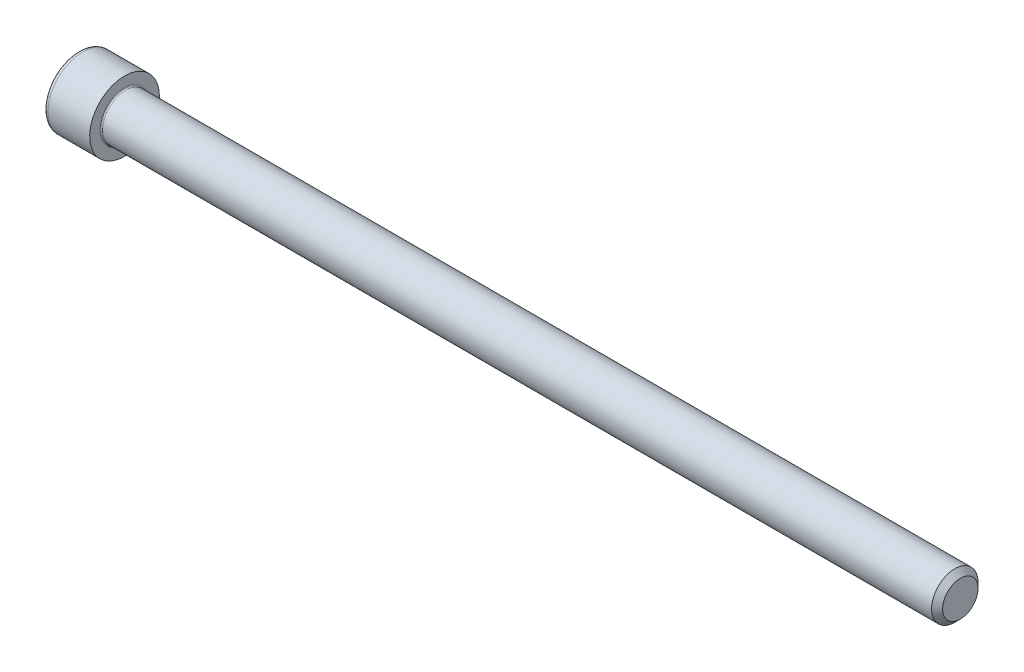
ISO-10303-21;
HEADER;
FILE_DESCRIPTION(('STEP AP214'),'2;1');
FILE_NAME('part.step','',(''),(''),'','','');
FILE_SCHEMA(('AUTOMOTIVE_DESIGN { 1 0 10303 214 1 1 1 1 }'));
ENDSEC;
DATA;
#1=APPLICATION_CONTEXT('core data for automotive mechanical design processes');
#2=APPLICATION_PROTOCOL_DEFINITION('international standard','automotive_design',2000,#1);
#3=PRODUCT_CONTEXT('',#1,'mechanical');
#4=PRODUCT('Part','Part','',(#3));
#5=PRODUCT_RELATED_PRODUCT_CATEGORY('part','',(#4));
#6=PRODUCT_DEFINITION_FORMATION('','',#4);
#7=PRODUCT_DEFINITION_CONTEXT('part definition',#1,'design');
#8=PRODUCT_DEFINITION('design','',#6,#7);
#9=PRODUCT_DEFINITION_SHAPE('','',#8);
#10=(LENGTH_UNIT() NAMED_UNIT(*) SI_UNIT(.MILLI.,.METRE.));
#11=(NAMED_UNIT(*) PLANE_ANGLE_UNIT() SI_UNIT($,.RADIAN.));
#12=(NAMED_UNIT(*) SI_UNIT($,.STERADIAN.) SOLID_ANGLE_UNIT());
#13=UNCERTAINTY_MEASURE_WITH_UNIT(LENGTH_MEASURE(1.E-05),#10,'distance_accuracy_value','');
#14=(GEOMETRIC_REPRESENTATION_CONTEXT(3) GLOBAL_UNCERTAINTY_ASSIGNED_CONTEXT((#13)) GLOBAL_UNIT_ASSIGNED_CONTEXT((#10,
#11,#12)) REPRESENTATION_CONTEXT('',''));
#15=CARTESIAN_POINT('',(0.,0.,0.));
#16=DIRECTION('',(0.,0.,1.));
#17=DIRECTION('',(1.,0.,0.));
#18=AXIS2_PLACEMENT_3D('',#15,#16,#17);
#19=CARTESIAN_POINT('',(-3.302,0.,0.));
#20=DIRECTION('',(-1.,0.,0.));
#21=DIRECTION('',(0.,-1.,0.));
#22=AXIS2_PLACEMENT_3D('',#19,#20,#21);
#23=CONICAL_SURFACE('',#22,2.7569630054343,1.0471975511966);
#24=CARTESIAN_POINT('',(-1.71026666666666,0.,0.));
#25=VERTEX_POINT('',#24);
#26=VERTEX_LOOP('',#25);
#27=FACE_BOUND('',#26,.T.);
#28=CARTESIAN_POINT('',(-3.30206667085494,0.000200000000433414,2.75707847548839));
#29=CARTESIAN_POINT('',(-3.26707753696983,-0.104723935463937,2.6965006131036));
#30=CARTESIAN_POINT('',(-3.2352559146133,-0.210553565393113,2.63539984777575));
#31=CARTESIAN_POINT('',(-3.17971030909145,-0.424045469620166,2.51214023940046));
#32=CARTESIAN_POINT('',(-3.15600597703146,-0.5317115380593,2.44997920580453));
#33=CARTESIAN_POINT('',(-3.11910584905482,-0.745709321959359,2.32642752766385));
#34=CARTESIAN_POINT('',(-3.10566447822797,-0.852008106597724,2.26505589573836));
#35=CARTESIAN_POINT('',(-3.08961674760199,-1.0651059825394,2.1420237796997));
#36=CARTESIAN_POINT('',(-3.08699710051457,-1.17190429901672,2.08036374293251));
#37=CARTESIAN_POINT('',(-3.09243976092168,-1.3714718573095,1.96514335943066));
#38=CARTESIAN_POINT('',(-3.09916570852556,-1.46427093659275,1.91156578602593));
#39=CARTESIAN_POINT('',(-3.1204852251421,-1.64926449459375,1.80475970551571));
#40=CARTESIAN_POINT('',(-3.13508608064024,-1.74145833320265,1.75153156797723));
#41=CARTESIAN_POINT('',(-3.1715879595363,-1.92683347580797,1.64450517949299));
#42=CARTESIAN_POINT('',(-3.19364375098414,-2.0199913112977,1.59072047809587));
#43=CARTESIAN_POINT('',(-3.24370205803596,-2.20491735878384,1.48395337479957));
#44=CARTESIAN_POINT('',(-3.27169280762564,-2.29668794093022,1.43096960449367));
#45=CARTESIAN_POINT('',(-3.30206667085479,-2.3878,1.37836603266331));
#46=B_SPLINE_CURVE_WITH_KNOTS('',3,(#28,#29,#30,#31,#32,#33,#34,#35,#36,#37,#38,#39,#40,#41,#42,
#43,#44,#45),.UNSPECIFIED.,.F.,.F.,(4,2,2,2,2,2,2,2,4),(0.,0.378469527554682,0.757848917720178,
1.12783830118156,1.49737326355518,1.81916504067634,2.14125507699924,2.4704906802841,
2.7990795790434),.UNSPECIFIED.);
#47=CARTESIAN_POINT('',(-3.30200000001923,0.,2.7569630054343));
#48=VERTEX_POINT('',#47);
#49=CARTESIAN_POINT('',(-3.30200000001923,-2.3876,1.37848150271715));
#50=VERTEX_POINT('',#49);
#51=EDGE_CURVE('E132',#48,#50,#46,.T.);
#52=ORIENTED_EDGE('',*,*,#51,.F.);
#53=CARTESIAN_POINT('',(-3.30206667085494,2.38780000000044,1.37836603266306));
#54=CARTESIAN_POINT('',(-3.26707753696983,2.28287606453606,1.43894389504785));
#55=CARTESIAN_POINT('',(-3.2352559146133,2.17704643460689,1.5000446603757));
#56=CARTESIAN_POINT('',(-3.17971030909145,1.96355453037984,1.62330426875099));
#57=CARTESIAN_POINT('',(-3.15600597703146,1.8558884619407,1.68546530234691));
#58=CARTESIAN_POINT('',(-3.11910584905482,1.64189067804064,1.8090169804876));
#59=CARTESIAN_POINT('',(-3.10566447822797,1.53559189340228,1.87038861241309));
#60=CARTESIAN_POINT('',(-3.08961674760199,1.3224940174606,1.99342072845175));
#61=CARTESIAN_POINT('',(-3.08699710051457,1.21569570098328,2.05508076521893));
#62=CARTESIAN_POINT('',(-3.09243976092168,1.0161281426905,2.17030114872078));
#63=CARTESIAN_POINT('',(-3.09916570852556,0.923329063407248,2.22387872212552));
#64=CARTESIAN_POINT('',(-3.1204852251421,0.738335505406253,2.33068480263574));
#65=CARTESIAN_POINT('',(-3.13508608064024,0.646141666797352,2.38391294017421));
#66=CARTESIAN_POINT('',(-3.1715879595363,0.460766524192034,2.49093932865846));
#67=CARTESIAN_POINT('',(-3.19364375098414,0.367608688702303,2.54472403005558));
#68=CARTESIAN_POINT('',(-3.24370205803596,0.182682641216162,2.65149113335188));
#69=CARTESIAN_POINT('',(-3.27169280762564,0.0909120590697815,2.70447490365778));
#70=CARTESIAN_POINT('',(-3.30206667085479,-0.000199999999999891,2.75707847548814));
#71=B_SPLINE_CURVE_WITH_KNOTS('',3,(#53,#54,#55,#56,#57,#58,#59,#60,#61,#62,#63,#64,#65,#66,#67,
#68,#69,#70),.UNSPECIFIED.,.F.,.F.,(4,2,2,2,2,2,2,2,4),(0.,0.378469527554682,0.757848917720177,
1.12783830118156,1.49737326355518,1.81916504067634,2.14125507699925,2.4704906802841,
2.7990795790434),.UNSPECIFIED.);
#72=CARTESIAN_POINT('',(-3.30200000001923,2.3876,1.37848150271715));
#73=VERTEX_POINT('',#72);
#74=EDGE_CURVE('E116',#73,#48,#71,.T.);
#75=ORIENTED_EDGE('',*,*,#74,.F.);
#76=CARTESIAN_POINT('',(-4.18979393601053,2.3876,-3.56980849321914));
#77=CARTESIAN_POINT('',(-4.14032815892821,2.3876,-3.46670370248886));
#78=CARTESIAN_POINT('',(-4.09137617294275,2.3876,-3.36334773439771));
#79=CARTESIAN_POINT('',(-3.99479124822564,2.3876,-3.15599957257145));
#80=CARTESIAN_POINT('',(-3.94715854687755,2.3876,-3.05200726839555));
#81=CARTESIAN_POINT('',(-3.85323755548223,2.3876,-2.84265630190437));
#82=CARTESIAN_POINT('',(-3.80695917341202,2.3876,-2.73729317779474));
#83=CARTESIAN_POINT('',(-3.71647764771049,2.3876,-2.52568279122073));
#84=CARTESIAN_POINT('',(-3.67227439617583,2.3876,-2.41943557506662));
#85=CARTESIAN_POINT('',(-3.58537011973026,2.3876,-2.20308925723331));
#86=CARTESIAN_POINT('',(-3.54273858869362,2.3876,-2.09296207559752));
#87=CARTESIAN_POINT('',(-3.46101994745047,2.3876,-1.87137563995219));
#88=CARTESIAN_POINT('',(-3.42193324834409,2.3876,-1.75991623313437));
#89=CARTESIAN_POINT('',(-3.34842202238522,2.3876,-1.53574546818941));
#90=CARTESIAN_POINT('',(-3.3139867136315,2.3876,-1.42303768420965));
#91=CARTESIAN_POINT('',(-3.2509559036791,2.3876,-1.19600683622335));
#92=CARTESIAN_POINT('',(-3.22235895212225,2.3876,-1.08168418094485));
#93=CARTESIAN_POINT('',(-3.17252928890006,2.3876,-0.851661734027278));
#94=CARTESIAN_POINT('',(-3.15128145205012,2.3876,-0.735965283877569));
#95=CARTESIAN_POINT('',(-3.11754136315291,2.3876,-0.503277987562836));
#96=CARTESIAN_POINT('',(-3.10504851942715,2.3876,-0.386287229412427));
#97=CARTESIAN_POINT('',(-3.08997750794679,2.3876,-0.153060820709615));
#98=CARTESIAN_POINT('',(-3.08728234032656,2.3876,-0.0368329177291767));
#99=CARTESIAN_POINT('',(-3.09173437046107,2.3876,0.195441211734909));
#100=CARTESIAN_POINT('',(-3.09888217765583,2.3876,0.311487426523711));
#101=CARTESIAN_POINT('',(-3.11929953408256,2.3876,0.512427197188799));
#102=CARTESIAN_POINT('',(-3.13048322640562,2.3876,0.597542928135908));
#103=CARTESIAN_POINT('',(-3.15737658155533,2.3876,0.767062617315265));
#104=CARTESIAN_POINT('',(-3.17308702751811,2.3876,0.851466449785063));
#105=CARTESIAN_POINT('',(-3.22617759497026,2.3876,1.10356659989914));
#106=CARTESIAN_POINT('',(-3.26950195890938,2.3876,1.27002026330531));
#107=CARTESIAN_POINT('',(-3.34351951443674,2.3876,1.51891846693128));
#108=CARTESIAN_POINT('',(-3.37004247651048,2.3876,1.60267504477746));
#109=CARTESIAN_POINT('',(-3.42554115129613,2.3876,1.76932116385019));
#110=CARTESIAN_POINT('',(-3.45451533329899,2.3876,1.85221121038454));
#111=CARTESIAN_POINT('',(-3.51449661718129,2.3876,2.01722886079908));
#112=CARTESIAN_POINT('',(-3.54550334960868,2.3876,2.09935660016092));
#113=CARTESIAN_POINT('',(-3.60921387627046,2.3876,2.26296537207273));
#114=CARTESIAN_POINT('',(-3.64191795723009,2.3876,2.34444629266072));
#115=CARTESIAN_POINT('',(-3.72749222624701,2.3876,2.55242893230761));
#116=CARTESIAN_POINT('',(-3.78137257985246,2.3876,2.67851448309363));
#117=CARTESIAN_POINT('',(-3.8917254000684,2.3876,2.92954963732602));
#118=CARTESIAN_POINT('',(-3.94819806086299,2.3876,3.05449915483192));
#119=CARTESIAN_POINT('',(-4.06314681218863,2.3876,3.30349712860239));
#120=CARTESIAN_POINT('',(-4.12162325025623,2.3876,3.42754542399003));
#121=CARTESIAN_POINT('',(-4.24013780231263,2.3876,3.6748949368526));
#122=CARTESIAN_POINT('',(-4.30017595103082,2.3876,3.7981961376383));
#123=CARTESIAN_POINT('',(-4.48227324944979,2.3876,4.16748745488008));
#124=CARTESIAN_POINT('',(-4.60617582250528,2.3876,4.41256771633377));
#125=CARTESIAN_POINT('',(-4.85714973382895,2.3876,4.90105019175774));
#126=CARTESIAN_POINT('',(-4.98422066930818,2.3876,5.14445261405767));
#127=CARTESIAN_POINT('',(-5.22846408211094,2.38760000000001,5.60717601476413));
#128=CARTESIAN_POINT('',(-5.34543879972904,2.38760000000001,5.82660154635426));
#129=CARTESIAN_POINT('',(-5.58072000325182,2.38760000000001,6.26474684956248));
#130=CARTESIAN_POINT('',(-5.69902653844135,2.38760000000001,6.48346659467455));
#131=CARTESIAN_POINT('',(-5.93633623854323,2.38760000000001,6.91980663495285));
#132=CARTESIAN_POINT('',(-6.05533686617889,2.38760000000001,7.13742831158591));
#133=CARTESIAN_POINT('',(-6.29411264362597,2.38760000000001,7.57223168560479));
#134=CARTESIAN_POINT('',(-6.41388775257905,2.38760000000001,7.78941340541968));
#135=CARTESIAN_POINT('',(-6.53394673725325,2.38760000000001,8.00643706714308));
#136=B_SPLINE_CURVE_WITH_KNOTS('',3,(#76,#77,#78,#79,#80,#81,#82,#83,#84,#85,#86,#87,#88,#89,
#90,#91,#92,#93,#94,#95,#96,#97,#98,#99,#100,#101,#102,#103,#104,#105,#106,#107,#108,#109,#110,
#111,#112,#113,#114,#115,#116,#117,#118,#119,#120,#121,#122,#123,#124,#125,#126,#127,#128,#129,
#130,#131,#132,#133,#134,#135),.UNSPECIFIED.,.F.,.F.,(4,2,2,2,2,2,2,2,2,2,2,2,2,2,2,2,2,2,2,2,2,
2,2,2,2,2,2,2,2,4),(0.,0.343075057157597,0.686211449189028,1.03142931875567,1.37662921763736,
1.73085459772213,2.08512100552917,2.4385515920946,2.79189427270901,3.14450535144263,
3.49709259777493,3.84545529792506,4.19383956835466,4.4512543032807,4.70871359816253,
5.22402691449442,5.4875755508175,5.75096080731955,6.01429832092988,6.27768046464175,
6.68898487147715,7.10032013867146,7.51172711288515,7.92314324382323,8.74696114416904,
9.57067484251388,10.3166417000106,11.0626362538742,11.8067333547366,12.5507915153776),.UNSPECIFIED.);
#137=CARTESIAN_POINT('',(-3.30200000001923,2.3876,-1.37848150271715));
#138=VERTEX_POINT('',#137);
#139=EDGE_CURVE('E124',#138,#73,#136,.T.);
#140=ORIENTED_EDGE('',*,*,#139,.F.);
#141=CARTESIAN_POINT('',(-3.30206667085479,-0.000200000000000576,-2.75707847548814));
#142=CARTESIAN_POINT('',(-3.2670775369697,0.104723935464364,-2.69650061310335));
#143=CARTESIAN_POINT('',(-3.23525591461318,0.210553565393532,-2.63539984777551));
#144=CARTESIAN_POINT('',(-3.17971030909135,0.42404546962057,-2.51214023940022));
#145=CARTESIAN_POINT('',(-3.15600597703138,0.531711538059696,-2.44997920580431));
#146=CARTESIAN_POINT('',(-3.11910584905476,0.74570932195974,-2.32642752766363));
#147=CARTESIAN_POINT('',(-3.10566447822793,0.852008106598096,-2.26505589573815));
#148=CARTESIAN_POINT('',(-3.08961674760197,1.06510598253976,-2.14202377969949));
#149=CARTESIAN_POINT('',(-3.08699710051457,1.17190429901707,-2.08036374293232));
#150=CARTESIAN_POINT('',(-3.0924397609217,1.37147185730985,-1.96514335943047));
#151=CARTESIAN_POINT('',(-3.09916570852559,1.46427093659311,-1.91156578602572));
#152=CARTESIAN_POINT('',(-3.12048522514215,1.64926449459412,-1.80475970551549));
#153=CARTESIAN_POINT('',(-3.1350860806403,1.74145833320303,-1.75153156797702));
#154=CARTESIAN_POINT('',(-3.17158795953639,1.92683347580836,-1.64450517949276));
#155=CARTESIAN_POINT('',(-3.19364375098424,2.0199913112981,-1.59072047809564));
#156=CARTESIAN_POINT('',(-3.24370205803608,2.20491735878426,-1.48395337479933));
#157=CARTESIAN_POINT('',(-3.27169280762577,2.29668794093064,-1.43096960449343));
#158=CARTESIAN_POINT('',(-3.30206667085494,2.38780000000043,-1.37836603266306));
#159=B_SPLINE_CURVE_WITH_KNOTS('',3,(#141,#142,#143,#144,#145,#146,#147,#148,#149,#150,#151,
#152,#153,#154,#155,#156,#157,#158),.UNSPECIFIED.,.F.,.F.,(4,2,2,2,2,2,2,2,4),(0.,
0.378469527554649,0.757848917720111,1.12783830118146,1.49737326355505,1.81916504067624,
2.14125507699918,2.47049068028407,2.7990795790434),.UNSPECIFIED.);
#160=CARTESIAN_POINT('',(-3.30200000001923,0.,-2.7569630054343));
#161=VERTEX_POINT('',#160);
#162=EDGE_CURVE('E161',#161,#138,#159,.T.);
#163=ORIENTED_EDGE('',*,*,#162,.F.);
#164=CARTESIAN_POINT('',(-3.30206667085479,-2.3878,-1.37836603266331));
#165=CARTESIAN_POINT('',(-3.2670775369697,-2.28287606453564,-1.4389438950481));
#166=CARTESIAN_POINT('',(-3.23525591461318,-2.17704643460647,-1.50004466037594));
#167=CARTESIAN_POINT('',(-3.17971030909135,-1.96355453037943,-1.62330426875123));
#168=CARTESIAN_POINT('',(-3.15600597703138,-1.8558884619403,-1.68546530234715));
#169=CARTESIAN_POINT('',(-3.11910584905476,-1.64189067804026,-1.80901698048782));
#170=CARTESIAN_POINT('',(-3.10566447822793,-1.5355918934019,-1.8703886124133));
#171=CARTESIAN_POINT('',(-3.08961674760197,-1.32249401746024,-1.99342072845196));
#172=CARTESIAN_POINT('',(-3.08699710051457,-1.21569570098293,-2.05508076521914));
#173=CARTESIAN_POINT('',(-3.0924397609217,-1.01612814269015,-2.17030114872099));
#174=CARTESIAN_POINT('',(-3.09916570852559,-0.923329063406891,-2.22387872212573));
#175=CARTESIAN_POINT('',(-3.12048522514215,-0.73833550540588,-2.33068480263596));
#176=CARTESIAN_POINT('',(-3.1350860806403,-0.646141666796972,-2.38391294017444));
#177=CARTESIAN_POINT('',(-3.17158795953639,-0.460766524191638,-2.49093932865869));
#178=CARTESIAN_POINT('',(-3.19364375098424,-0.3676086887019,-2.54472403005581));
#179=CARTESIAN_POINT('',(-3.24370205803608,-0.182682641215744,-2.65149113335212));
#180=CARTESIAN_POINT('',(-3.27169280762577,-0.0909120590693554,-2.70447490365803));
#181=CARTESIAN_POINT('',(-3.30206667085494,0.000200000000432987,-2.75707847548839));
#182=B_SPLINE_CURVE_WITH_KNOTS('',3,(#164,#165,#166,#167,#168,#169,#170,#171,#172,#173,#174,
#175,#176,#177,#178,#179,#180,#181),.UNSPECIFIED.,.F.,.F.,(4,2,2,2,2,2,2,2,4),(0.,
0.378469527554649,0.75784891772011,1.12783830118146,1.49737326355505,1.81916504067624,
2.14125507699918,2.47049068028407,2.7990795790434),.UNSPECIFIED.);
#183=CARTESIAN_POINT('',(-3.30200000001923,-2.3876,-1.37848150271715));
#184=VERTEX_POINT('',#183);
#185=EDGE_CURVE('E171',#184,#161,#182,.T.);
#186=ORIENTED_EDGE('',*,*,#185,.F.);
#187=CARTESIAN_POINT('',(-4.18979393539434,-2.3876,-3.56980849193515));
#188=CARTESIAN_POINT('',(-4.14032815833857,-2.3876,-3.46670370124875));
#189=CARTESIAN_POINT('',(-4.09137617237963,-2.3876,-3.36334773320152));
#190=CARTESIAN_POINT('',(-3.99479124771543,-2.3876,-3.15599957146324));
#191=CARTESIAN_POINT('',(-3.94715854639372,-2.3876,-3.05200726733141));
#192=CARTESIAN_POINT('',(-3.8532375550512,-2.3876,-2.84265630092922));
#193=CARTESIAN_POINT('',(-3.8069591730074,-2.3876,-2.73729317686451));
#194=CARTESIAN_POINT('',(-3.71647764735818,-2.3876,-2.52568279038068));
#195=CARTESIAN_POINT('',(-3.67227439584941,-2.3876,-2.41943557427184));
#196=CARTESIAN_POINT('',(-3.58537011945579,-2.3876,-2.2030892565317));
#197=CARTESIAN_POINT('',(-3.54273858844516,-2.3876,-2.09296207494383));
#198=CARTESIAN_POINT('',(-3.46101994725245,-2.3876,-1.87137563939521));
#199=CARTESIAN_POINT('',(-3.42193324817049,-2.3876,-1.75991623262616));
#200=CARTESIAN_POINT('',(-3.34842202225778,-2.3876,-1.53574546777968));
#201=CARTESIAN_POINT('',(-3.31398671352581,-2.3876,-1.4230376838496));
#202=CARTESIAN_POINT('',(-3.25095590361285,-2.3876,-1.19600683596409));
#203=CARTESIAN_POINT('',(-3.22235895207369,-2.3876,-1.08168418073668));
#204=CARTESIAN_POINT('',(-3.17252928888399,-2.3876,-0.851661733937182));
#205=CARTESIAN_POINT('',(-3.15128145204795,-2.3876,-0.735965283854639));
#206=CARTESIAN_POINT('',(-3.11754136316811,-2.3876,-0.503277987675645));
#207=CARTESIAN_POINT('',(-3.10504851944584,-2.3876,-0.386287229593808));
#208=CARTESIAN_POINT('',(-3.08997750796041,-2.3876,-0.153060821026864));
#209=CARTESIAN_POINT('',(-3.08728234033184,-2.3876,-0.0368329181137151));
#210=CARTESIAN_POINT('',(-3.0917343704385,-2.3876,0.195441211217051));
#211=CARTESIAN_POINT('',(-3.09888217761376,-2.3876,0.311487425939823));
#212=CARTESIAN_POINT('',(-3.11929953400169,-2.3876,0.512427196518833));
#213=CARTESIAN_POINT('',(-3.130483226309,-2.3876,0.597542927445186));
#214=CARTESIAN_POINT('',(-3.15737658142634,-2.3876,0.767062616583859));
#215=CARTESIAN_POINT('',(-3.17308702737249,-2.3876,0.851466449033728));
#216=CARTESIAN_POINT('',(-3.22617759477434,-2.3876,1.10356659908891));
#217=CARTESIAN_POINT('',(-3.26950195867939,-2.3876,1.27002026245713));
#218=CARTESIAN_POINT('',(-3.34351951415623,-2.3876,1.51891846602621));
#219=CARTESIAN_POINT('',(-3.37004247621298,-2.3876,1.60267504385305));
#220=CARTESIAN_POINT('',(-3.4255411509651,-2.3876,1.76932116288731));
#221=CARTESIAN_POINT('',(-3.45451533295141,-2.3876,1.85221120940253));
#222=CARTESIAN_POINT('',(-3.51449661680109,-2.3876,2.01722885977888));
#223=CARTESIAN_POINT('',(-3.54550334921242,-2.3876,2.09935659912167));
#224=CARTESIAN_POINT('',(-3.60921387584251,-2.3876,2.26296537099539));
#225=CARTESIAN_POINT('',(-3.64191795678652,-2.3876,2.34444629156432));
#226=CARTESIAN_POINT('',(-3.72749222577887,-2.3876,2.55242893119857));
#227=CARTESIAN_POINT('',(-3.78137257937665,-2.3876,2.67851448199057));
#228=CARTESIAN_POINT('',(-3.89172539957937,-2.3876,2.92954963623418));
#229=CARTESIAN_POINT('',(-3.94819806036842,-2.3876,3.05449915374532));
#230=CARTESIAN_POINT('',(-4.06314681168454,-2.3876,3.30349712752571));
#231=CARTESIAN_POINT('',(-4.12162324974816,-2.3876,3.42754542291804));
#232=CARTESIAN_POINT('',(-4.24013780179773,-2.3876,3.67489493578953));
#233=CARTESIAN_POINT('',(-4.30017595051308,-2.3876,3.79819613657944));
#234=CARTESIAN_POINT('',(-4.48227324892495,-2.3876,4.1674874538337));
#235=CARTESIAN_POINT('',(-4.60617582197744,-2.3876,4.41256771529511));
#236=CARTESIAN_POINT('',(-4.85714973329697,-2.3876,4.90105019073352));
#237=CARTESIAN_POINT('',(-4.98422066877507,-2.3876,5.14445261304019));
#238=CARTESIAN_POINT('',(-5.22846408157354,-2.3876,5.60717601375278));
#239=CARTESIAN_POINT('',(-5.34543879918833,-2.3876,5.82660154534238));
#240=CARTESIAN_POINT('',(-5.58072000270508,-2.3876,6.26474684854927));
#241=CARTESIAN_POINT('',(-5.69902653789189,-2.3876,6.48346659366053));
#242=CARTESIAN_POINT('',(-5.93633623798831,-2.3876,6.91980663393625));
#243=CARTESIAN_POINT('',(-6.05533686562125,-2.3876,7.13742831056755));
#244=CARTESIAN_POINT('',(-6.29411264306314,-2.3876,7.57223168458273));
#245=CARTESIAN_POINT('',(-6.41388775201376,-2.3876,7.78941340439569));
#246=CARTESIAN_POINT('',(-6.5339467366856,-2.3876,8.0064370661171));
#247=B_SPLINE_CURVE_WITH_KNOTS('',3,(#187,#188,#189,#190,#191,#192,#193,#194,#195,#196,#197,
#198,#199,#200,#201,#202,#203,#204,#205,#206,#207,#208,#209,#210,#211,#212,#213,#214,#215,#216,
#217,#218,#219,#220,#221,#222,#223,#224,#225,#226,#227,#228,#229,#230,#231,#232,#233,#234,#235,
#236,#237,#238,#239,#240,#241,#242,#243,#244,#245,#246),.UNSPECIFIED.,.F.,.F.,(4,2,2,2,2,2,2,2,
2,2,2,2,2,2,2,2,2,2,2,2,2,2,2,2,2,2,2,2,2,4),(0.,0.34307505700446,0.686211448882729,
1.03142931829414,1.3766292170206,1.73085459694314,2.08512100458788,2.43855159099179,
2.79189427144482,3.1445053499732,3.49709259610054,3.84545529605019,4.19383956627912,
4.45125430113728,4.70871359595122,5.22402691214699,5.48757554839939,5.75096080483083,
6.01429831837067,6.27768046201202,6.68898486885481,7.10032013605656,7.51172711027787,
7.92314324122357,8.74696114158592,9.57067483994708,10.3166416974377,11.0626362512953,
11.8067333521491,12.5507915127815),.UNSPECIFIED.);
#248=EDGE_CURVE('E174',#50,#184,#247,.F.);
#249=ORIENTED_EDGE('',*,*,#248,.F.);
#250=EDGE_LOOP('',(#52,#75,#140,#163,#186,#249));
#251=FACE_BOUND('',#250,.T.);
#252=ADVANCED_FACE('F60',(#27,#251),#23,.F.);
#253=CARTESIAN_POINT('',(114.3,0.,0.));
#254=DIRECTION('',(-1.,0.,0.));
#255=DIRECTION('',(0.,-1.,0.));
#256=AXIS2_PLACEMENT_3D('',#253,#254,#255);
#257=PLANE('',#256);
#258=CARTESIAN_POINT('',(114.3,0.,0.));
#259=DIRECTION('',(-1.,0.,0.));
#260=DIRECTION('',(0.,-1.,0.));
#261=AXIS2_PLACEMENT_3D('',#258,#259,#260);
#262=CIRCLE('',#261,2.41935000000007);
#263=CARTESIAN_POINT('',(114.3,-2.41935000000006,0.));
#264=VERTEX_POINT('',#263);
#265=EDGE_CURVE('E247',#264,#264,#262,.F.);
#266=ORIENTED_EDGE('',*,*,#265,.T.);
#267=EDGE_LOOP('',(#266));
#268=FACE_BOUND('',#267,.T.);
#269=ADVANCED_FACE('F227',(#268),#257,.F.);
#270=CARTESIAN_POINT('',(-1.71026666666666,0.,0.));
#271=DIRECTION('',(-1.,0.,0.));
#272=DIRECTION('',(0.,-1.,0.));
#273=AXIS2_PLACEMENT_3D('',#270,#271,#272);
#274=CYLINDRICAL_SURFACE('',#273,3.17500000000001);
#275=CARTESIAN_POINT('',(0.177800000000001,0.,0.));
#276=DIRECTION('',(-1.,0.,0.));
#277=DIRECTION('',(0.,-1.,0.));
#278=AXIS2_PLACEMENT_3D('',#275,#276,#277);
#279=CIRCLE('',#278,3.17500000000001);
#280=CARTESIAN_POINT('',(0.177800000000001,-3.17500000000001,0.));
#281=VERTEX_POINT('',#280);
#282=EDGE_CURVE('E12',#281,#281,#279,.F.);
#283=ORIENTED_EDGE('',*,*,#282,.T.);
#284=EDGE_LOOP('',(#283));
#285=FACE_BOUND('',#284,.T.);
#286=CARTESIAN_POINT('',(113.54435,0.,0.));
#287=DIRECTION('',(-1.,0.,0.));
#288=DIRECTION('',(0.,-1.,0.));
#289=AXIS2_PLACEMENT_3D('',#286,#287,#288);
#290=CIRCLE('',#289,3.17500000000001);
#291=CARTESIAN_POINT('',(113.54435,-3.175,0.));
#292=VERTEX_POINT('',#291);
#293=EDGE_CURVE('E250',#292,#292,#290,.T.);
#294=ORIENTED_EDGE('',*,*,#293,.T.);
#295=EDGE_LOOP('',(#294));
#296=FACE_BOUND('',#295,.T.);
#297=ADVANCED_FACE('F223',(#285,#296),#274,.T.);
#298=CARTESIAN_POINT('',(0.,3.175,0.));
#299=DIRECTION('',(-1.,0.,0.));
#300=DIRECTION('',(0.,-1.,0.));
#301=AXIS2_PLACEMENT_3D('',#298,#299,#300);
#302=PLANE('',#301);
#303=CARTESIAN_POINT('',(0.,0.,0.));
#304=DIRECTION('',(-1.,0.,0.));
#305=DIRECTION('',(0.,-1.,0.));
#306=AXIS2_PLACEMENT_3D('',#303,#304,#305);
#307=CIRCLE('',#306,3.35280000000001);
#308=CARTESIAN_POINT('',(0.,-3.35280000000001,0.));
#309=VERTEX_POINT('',#308);
#310=EDGE_CURVE('E68',#309,#309,#307,.T.);
#311=ORIENTED_EDGE('',*,*,#310,.T.);
#312=EDGE_LOOP('',(#311));
#313=FACE_BOUND('',#312,.T.);
#314=CARTESIAN_POINT('',(0.,0.,0.));
#315=DIRECTION('',(-1.,0.,0.));
#316=DIRECTION('',(0.,-1.,0.));
#317=AXIS2_PLACEMENT_3D('',#314,#315,#316);
#318=CIRCLE('',#317,4.7625);
#319=CARTESIAN_POINT('',(0.,-4.7625,0.));
#320=VERTEX_POINT('',#319);
#321=EDGE_CURVE('E265',#320,#320,#318,.T.);
#322=ORIENTED_EDGE('',*,*,#321,.F.);
#323=EDGE_LOOP('',(#322));
#324=FACE_BOUND('',#323,.T.);
#325=ADVANCED_FACE('F219',(#313,#324),#302,.F.);
#326=CARTESIAN_POINT('',(-1.71026666666666,0.,0.));
#327=DIRECTION('',(-1.,0.,0.));
#328=DIRECTION('',(0.,-1.,0.));
#329=AXIS2_PLACEMENT_3D('',#326,#327,#328);
#330=CYLINDRICAL_SURFACE('',#329,4.7625);
#331=CARTESIAN_POINT('',(-5.715,0.,0.));
#332=DIRECTION('',(1.,0.,0.));
#333=DIRECTION('',(0.,1.,0.));
#334=AXIS2_PLACEMENT_3D('',#331,#332,#333);
#335=CIRCLE('',#334,4.7625);
#336=CARTESIAN_POINT('',(-5.715,4.7625,0.));
#337=VERTEX_POINT('',#336);
#338=EDGE_CURVE('E252',#337,#337,#335,.T.);
#339=ORIENTED_EDGE('',*,*,#338,.T.);
#340=EDGE_LOOP('',(#339));
#341=FACE_BOUND('',#340,.T.);
#342=ORIENTED_EDGE('',*,*,#321,.T.);
#343=EDGE_LOOP('',(#342));
#344=FACE_BOUND('',#343,.T.);
#345=ADVANCED_FACE('F215',(#341,#344),#330,.T.);
#346=CARTESIAN_POINT('',(-6.35,4.7625,0.));
#347=DIRECTION('',(1.,0.,0.));
#348=DIRECTION('',(0.,1.,0.));
#349=AXIS2_PLACEMENT_3D('',#346,#347,#348);
#350=PLANE('',#349);
#351=CARTESIAN_POINT('',(-6.35,0.,0.));
#352=DIRECTION('',(1.,0.,0.));
#353=DIRECTION('',(0.,1.,0.));
#354=AXIS2_PLACEMENT_3D('',#351,#352,#353);
#355=CIRCLE('',#354,4.1275);
#356=CARTESIAN_POINT('',(-6.35,4.1275,0.));
#357=VERTEX_POINT('',#356);
#358=EDGE_CURVE('E256',#357,#357,#355,.F.);
#359=ORIENTED_EDGE('',*,*,#358,.T.);
#360=EDGE_LOOP('',(#359));
#361=FACE_BOUND('',#360,.T.);
#362=DIRECTION('',(0.,0.,1.));
#363=VECTOR('',#362,1.);
#364=CARTESIAN_POINT('',(-6.35,2.3876,0.));
#365=LINE('',#364,#363);
#366=CARTESIAN_POINT('',(-6.35,2.3876,-1.37848150271715));
#367=VERTEX_POINT('',#366);
#368=CARTESIAN_POINT('',(-6.35,2.3876,1.37848150271715));
#369=VERTEX_POINT('',#368);
#370=EDGE_CURVE('E123',#367,#369,#365,.T.);
#371=ORIENTED_EDGE('',*,*,#370,.T.);
#372=DIRECTION('',(0.,-0.866025403784438,0.500000000000001));
#373=VECTOR('',#372,1.);
#374=CARTESIAN_POINT('',(-6.35,1.1938,2.06772225407572));
#375=LINE('',#374,#373);
#376=CARTESIAN_POINT('',(-6.35,0.,2.7569630054343));
#377=VERTEX_POINT('',#376);
#378=EDGE_CURVE('E119',#369,#377,#375,.T.);
#379=ORIENTED_EDGE('',*,*,#378,.T.);
#380=DIRECTION('',(0.,-0.866025403784439,-0.5));
#381=VECTOR('',#380,1.);
#382=CARTESIAN_POINT('',(-6.35,-1.1938,2.06772225407573));
#383=LINE('',#382,#381);
#384=CARTESIAN_POINT('',(-6.35,-2.3876,1.37848150271715));
#385=VERTEX_POINT('',#384);
#386=EDGE_CURVE('E205',#377,#385,#383,.T.);
#387=ORIENTED_EDGE('',*,*,#386,.T.);
#388=DIRECTION('',(0.,0.,-1.));
#389=VECTOR('',#388,1.);
#390=CARTESIAN_POINT('',(-6.35,-2.3876,0.));
#391=LINE('',#390,#389);
#392=CARTESIAN_POINT('',(-6.35,-2.3876,-1.37848150271715));
#393=VERTEX_POINT('',#392);
#394=EDGE_CURVE('E75',#385,#393,#391,.T.);
#395=ORIENTED_EDGE('',*,*,#394,.T.);
#396=DIRECTION('',(0.,0.866025403784439,-0.5));
#397=VECTOR('',#396,1.);
#398=CARTESIAN_POINT('',(-6.35,-1.1938,-2.06772225407573));
#399=LINE('',#398,#397);
#400=CARTESIAN_POINT('',(-6.35,0.,-2.7569630054343));
#401=VERTEX_POINT('',#400);
#402=EDGE_CURVE('E170',#393,#401,#399,.T.);
#403=ORIENTED_EDGE('',*,*,#402,.T.);
#404=DIRECTION('',(0.,0.866025403784439,0.5));
#405=VECTOR('',#404,1.);
#406=CARTESIAN_POINT('',(-6.35,1.1938,-2.06772225407573));
#407=LINE('',#406,#405);
#408=EDGE_CURVE('E166',#401,#367,#407,.T.);
#409=ORIENTED_EDGE('',*,*,#408,.T.);
#410=EDGE_LOOP('',(#371,#379,#387,#395,#403,#409));
#411=FACE_BOUND('',#410,.T.);
#412=ADVANCED_FACE('F211',(#361,#411),#350,.F.);
#413=CARTESIAN_POINT('',(500000.,-1.19379999999957,2.06772225407573));
#414=DIRECTION('',(0.,0.5,-0.866025403784439));
#415=DIRECTION('',(0.,0.866025403784439,0.5));
#416=AXIS2_PLACEMENT_3D('',#413,#414,#415);
#417=PLANE('',#416);
#418=DIRECTION('',(-1.,0.,0.));
#419=VECTOR('',#418,1.);
#420=CARTESIAN_POINT('',(500000.,4.33469536306741E-13,2.7569630054343));
#421=LINE('',#420,#419);
#422=EDGE_CURVE('E270',#48,#377,#421,.T.);
#423=ORIENTED_EDGE('',*,*,#422,.F.);
#424=ORIENTED_EDGE('',*,*,#51,.T.);
#425=DIRECTION('',(-1.,0.,0.));
#426=VECTOR('',#425,1.);
#427=CARTESIAN_POINT('',(500000.,-2.38759999999957,1.37848150271715));
#428=LINE('',#427,#426);
#429=EDGE_CURVE('E204',#50,#385,#428,.T.);
#430=ORIENTED_EDGE('',*,*,#429,.T.);
#431=ORIENTED_EDGE('',*,*,#386,.F.);
#432=EDGE_LOOP('',(#423,#424,#430,#431));
#433=FACE_BOUND('',#432,.T.);
#434=ADVANCED_FACE('F190',(#433),#417,.T.);
#435=CARTESIAN_POINT('',(500000.,-2.38759999999957,0.));
#436=DIRECTION('',(0.,1.,0.));
#437=DIRECTION('',(0.,0.,1.));
#438=AXIS2_PLACEMENT_3D('',#435,#436,#437);
#439=PLANE('',#438);
#440=ORIENTED_EDGE('',*,*,#429,.F.);
#441=ORIENTED_EDGE('',*,*,#248,.T.);
#442=DIRECTION('',(-1.,0.,0.));
#443=VECTOR('',#442,1.);
#444=CARTESIAN_POINT('',(500000.,-2.38759999999957,-1.37848150271715));
#445=LINE('',#444,#443);
#446=EDGE_CURVE('E181',#184,#393,#445,.T.);
#447=ORIENTED_EDGE('',*,*,#446,.T.);
#448=ORIENTED_EDGE('',*,*,#394,.F.);
#449=EDGE_LOOP('',(#440,#441,#447,#448));
#450=FACE_BOUND('',#449,.T.);
#451=ADVANCED_FACE('F186',(#450),#439,.T.);
#452=CARTESIAN_POINT('',(500000.,-1.19379999999957,-2.06772225407573));
#453=DIRECTION('',(0.,0.5,0.866025403784439));
#454=DIRECTION('',(0.,-0.866025403784439,0.5));
#455=AXIS2_PLACEMENT_3D('',#452,#453,#454);
#456=PLANE('',#455);
#457=ORIENTED_EDGE('',*,*,#446,.F.);
#458=ORIENTED_EDGE('',*,*,#185,.T.);
#459=DIRECTION('',(-1.,0.,0.));
#460=VECTOR('',#459,1.);
#461=CARTESIAN_POINT('',(500000.,4.33252695872244E-13,-2.7569630054343));
#462=LINE('',#461,#460);
#463=EDGE_CURVE('E167',#161,#401,#462,.T.);
#464=ORIENTED_EDGE('',*,*,#463,.T.);
#465=ORIENTED_EDGE('',*,*,#402,.F.);
#466=EDGE_LOOP('',(#457,#458,#464,#465));
#467=FACE_BOUND('',#466,.T.);
#468=ADVANCED_FACE('F156',(#467),#456,.T.);
#469=CARTESIAN_POINT('',(500000.,1.19380000000043,-2.06772225407573));
#470=DIRECTION('',(0.,-0.5,0.866025403784439));
#471=DIRECTION('',(0.,-0.866025403784439,-0.5));
#472=AXIS2_PLACEMENT_3D('',#469,#470,#471);
#473=PLANE('',#472);
#474=ORIENTED_EDGE('',*,*,#463,.F.);
#475=ORIENTED_EDGE('',*,*,#162,.T.);
#476=DIRECTION('',(-1.,0.,0.));
#477=VECTOR('',#476,1.);
#478=CARTESIAN_POINT('',(500000.,2.38760000000043,-1.37848150271715));
#479=LINE('',#478,#477);
#480=EDGE_CURVE('E137',#138,#367,#479,.T.);
#481=ORIENTED_EDGE('',*,*,#480,.T.);
#482=ORIENTED_EDGE('',*,*,#408,.F.);
#483=EDGE_LOOP('',(#474,#475,#481,#482));
#484=FACE_BOUND('',#483,.T.);
#485=ADVANCED_FACE('F152',(#484),#473,.T.);
#486=CARTESIAN_POINT('',(500000.,2.38760000000043,0.));
#487=DIRECTION('',(0.,-1.,0.));
#488=DIRECTION('',(0.,0.,-1.));
#489=AXIS2_PLACEMENT_3D('',#486,#487,#488);
#490=PLANE('',#489);
#491=ORIENTED_EDGE('',*,*,#480,.F.);
#492=ORIENTED_EDGE('',*,*,#139,.T.);
#493=DIRECTION('',(-1.,0.,0.));
#494=VECTOR('',#493,1.);
#495=CARTESIAN_POINT('',(500000.,2.38760000000044,1.37848150271715));
#496=LINE('',#495,#494);
#497=EDGE_CURVE('E113',#73,#369,#496,.T.);
#498=ORIENTED_EDGE('',*,*,#497,.T.);
#499=ORIENTED_EDGE('',*,*,#370,.F.);
#500=EDGE_LOOP('',(#491,#492,#498,#499));
#501=FACE_BOUND('',#500,.T.);
#502=ADVANCED_FACE('F135',(#501),#490,.T.);
#503=CARTESIAN_POINT('',(500000.,1.19380000000043,2.06772225407572));
#504=DIRECTION('',(0.,-0.500000000000001,-0.866025403784438));
#505=DIRECTION('',(0.,0.866025403784438,-0.500000000000001));
#506=AXIS2_PLACEMENT_3D('',#503,#504,#505);
#507=PLANE('',#506);
#508=ORIENTED_EDGE('',*,*,#497,.F.);
#509=ORIENTED_EDGE('',*,*,#74,.T.);
#510=ORIENTED_EDGE('',*,*,#422,.T.);
#511=ORIENTED_EDGE('',*,*,#378,.F.);
#512=EDGE_LOOP('',(#508,#509,#510,#511));
#513=FACE_BOUND('',#512,.T.);
#514=ADVANCED_FACE('F115',(#513),#507,.T.);
#515=CARTESIAN_POINT('',(-5.715,0.,0.));
#516=DIRECTION('',(1.,0.,0.));
#517=DIRECTION('',(0.,1.,0.));
#518=AXIS2_PLACEMENT_3D('',#515,#516,#517);
#519=TOROIDAL_SURFACE('',#518,4.1275,0.635);
#520=ORIENTED_EDGE('',*,*,#338,.F.);
#521=EDGE_LOOP('',(#520));
#522=FACE_BOUND('',#521,.T.);
#523=ORIENTED_EDGE('',*,*,#358,.F.);
#524=EDGE_LOOP('',(#523));
#525=FACE_BOUND('',#524,.T.);
#526=ADVANCED_FACE('F234',(#522,#525),#519,.T.);
#527=CARTESIAN_POINT('',(113.54435,0.,0.));
#528=DIRECTION('',(-1.,0.,0.));
#529=DIRECTION('',(0.,-1.,0.));
#530=AXIS2_PLACEMENT_3D('',#527,#528,#529);
#531=CONICAL_SURFACE('',#530,3.17500000000001,0.785398163397455);
#532=CARTESIAN_POINT('',(114.3,-2.41935000000006,0.));
#533=CARTESIAN_POINT('',(114.292128645833,-2.42722135416673,0.));
#534=CARTESIAN_POINT('',(114.284257291667,-2.43509270833339,0.));
#535=CARTESIAN_POINT('',(114.268514583333,-2.45083541666673,0.));
#536=CARTESIAN_POINT('',(114.260643229167,-2.45870677083339,0.));
#537=CARTESIAN_POINT('',(114.244900520833,-2.47444947916672,0.));
#538=CARTESIAN_POINT('',(114.237029166667,-2.48232083333339,0.));
#539=CARTESIAN_POINT('',(114.221286458333,-2.49806354166672,0.));
#540=CARTESIAN_POINT('',(114.213415104167,-2.50593489583339,0.));
#541=CARTESIAN_POINT('',(114.197672395833,-2.52167760416672,0.));
#542=CARTESIAN_POINT('',(114.189801041667,-2.52954895833339,0.));
#543=CARTESIAN_POINT('',(114.174058333333,-2.54529166666672,0.));
#544=CARTESIAN_POINT('',(114.166186979167,-2.55316302083338,0.));
#545=CARTESIAN_POINT('',(114.150444270833,-2.56890572916672,0.));
#546=CARTESIAN_POINT('',(114.142572916667,-2.57677708333338,0.));
#547=CARTESIAN_POINT('',(114.126830208333,-2.59251979166672,0.));
#548=CARTESIAN_POINT('',(114.118958854167,-2.60039114583338,0.));
#549=CARTESIAN_POINT('',(114.103216145833,-2.61613385416671,0.));
#550=CARTESIAN_POINT('',(114.095344791667,-2.62400520833338,0.));
#551=CARTESIAN_POINT('',(114.079602083333,-2.63974791666671,0.));
#552=CARTESIAN_POINT('',(114.071730729167,-2.64761927083338,0.));
#553=CARTESIAN_POINT('',(114.055988020833,-2.66336197916671,0.));
#554=CARTESIAN_POINT('',(114.048116666667,-2.67123333333337,0.));
#555=CARTESIAN_POINT('',(114.032373958333,-2.68697604166671,0.));
#556=CARTESIAN_POINT('',(114.024502604167,-2.69484739583337,0.));
#557=CARTESIAN_POINT('',(114.008759895833,-2.71059010416671,0.));
#558=CARTESIAN_POINT('',(114.000888541667,-2.71846145833337,0.));
#559=CARTESIAN_POINT('',(113.985145833333,-2.7342041666667,0.));
#560=CARTESIAN_POINT('',(113.977274479167,-2.74207552083337,0.));
#561=CARTESIAN_POINT('',(113.961531770833,-2.7578182291667,0.));
#562=CARTESIAN_POINT('',(113.953660416667,-2.76568958333337,0.));
#563=CARTESIAN_POINT('',(113.937917708333,-2.7814322916667,0.));
#564=CARTESIAN_POINT('',(113.930046354167,-2.78930364583336,0.));
#565=CARTESIAN_POINT('',(113.914303645833,-2.8050463541667,0.));
#566=CARTESIAN_POINT('',(113.906432291667,-2.81291770833336,0.));
#567=CARTESIAN_POINT('',(113.890689583333,-2.8286604166667,0.));
#568=CARTESIAN_POINT('',(113.882818229167,-2.83653177083336,0.));
#569=CARTESIAN_POINT('',(113.867075520833,-2.85227447916669,0.));
#570=CARTESIAN_POINT('',(113.859204166667,-2.86014583333336,0.));
#571=CARTESIAN_POINT('',(113.843461458333,-2.87588854166669,0.));
#572=CARTESIAN_POINT('',(113.835590104167,-2.88375989583336,0.));
#573=CARTESIAN_POINT('',(113.819847395833,-2.89950260416669,0.));
#574=CARTESIAN_POINT('',(113.811976041667,-2.90737395833336,0.));
#575=CARTESIAN_POINT('',(113.796233333333,-2.92311666666669,0.));
#576=CARTESIAN_POINT('',(113.788361979167,-2.93098802083335,0.));
#577=CARTESIAN_POINT('',(113.772619270833,-2.94673072916668,0.));
#578=CARTESIAN_POINT('',(113.764747916667,-2.95460208333335,0.));
#579=CARTESIAN_POINT('',(113.749005208333,-2.97034479166668,0.));
#580=CARTESIAN_POINT('',(113.741133854167,-2.97821614583335,0.));
#581=CARTESIAN_POINT('',(113.725391145833,-2.99395885416668,0.));
#582=CARTESIAN_POINT('',(113.717519791667,-3.00183020833335,0.));
#583=CARTESIAN_POINT('',(113.701777083333,-3.01757291666668,0.));
#584=CARTESIAN_POINT('',(113.693905729167,-3.02544427083335,0.));
#585=CARTESIAN_POINT('',(113.678163020833,-3.04118697916668,0.));
#586=CARTESIAN_POINT('',(113.670291666667,-3.04905833333334,0.));
#587=CARTESIAN_POINT('',(113.654548958333,-3.06480104166668,0.));
#588=CARTESIAN_POINT('',(113.646677604167,-3.07267239583334,0.));
#589=CARTESIAN_POINT('',(113.630934895833,-3.08841510416667,0.));
#590=CARTESIAN_POINT('',(113.623063541667,-3.09628645833334,0.));
#591=CARTESIAN_POINT('',(113.607320833333,-3.11202916666667,0.));
#592=CARTESIAN_POINT('',(113.599449479167,-3.11990052083334,0.));
#593=CARTESIAN_POINT('',(113.583706770833,-3.13564322916667,0.));
#594=CARTESIAN_POINT('',(113.575835416667,-3.14351458333334,0.));
#595=CARTESIAN_POINT('',(113.560092708333,-3.15925729166667,0.));
#596=CARTESIAN_POINT('',(113.552221354167,-3.16712864583334,0.));
#597=CARTESIAN_POINT('',(113.54435,-3.175,0.));
#598=B_SPLINE_CURVE_WITH_KNOTS('',3,(#532,#533,#534,#535,#536,#537,#538,#539,#540,#541,#542,
#543,#544,#545,#546,#547,#548,#549,#550,#551,#552,#553,#554,#555,#556,#557,#558,#559,#560,#561,
#562,#563,#564,#565,#566,#567,#568,#569,#570,#571,#572,#573,#574,#575,#576,#577,#578,#579,#580,
#581,#582,#583,#584,#585,#586,#587,#588,#589,#590,#591,#592,#593,#594,#595,#596,#597),
.UNSPECIFIED.,.F.,.F.,(4,2,2,2,2,2,2,2,2,2,2,2,2,2,2,2,2,2,2,2,2,2,2,2,2,2,2,2,2,2,2,2,4),(0.,
0.0333953274502221,0.0667906549004438,0.100185982350666,0.133581309800888,0.16697663725111,
0.200371964701332,0.233767292151554,0.267162619601776,0.300557947051998,0.33395327450222,
0.367348601952452,0.400743929402674,0.434139256852896,0.467534584303118,0.500929911753339,
0.534325239203562,0.567720566653784,0.601115894104005,0.634511221554227,0.66790654900445,
0.701301876454671,0.734697203904903,0.768092531355125,0.801487858805347,0.834883186255569,
0.868278513705791,0.901673841156013,0.935069168606235,0.968464496056457,1.00185982350668,
1.0352551509569,1.06865047840713),.UNSPECIFIED.);
#599=EDGE_CURVE('BSEAM236',#264,#292,#598,.T.);
#600=ORIENTED_EDGE('',*,*,#265,.F.);
#601=ORIENTED_EDGE('',*,*,#293,.F.);
#602=ORIENTED_EDGE('',*,*,#599,.T.);
#603=ORIENTED_EDGE('',*,*,#599,.F.);
#604=EDGE_LOOP('',(#600,#602,#601,#603));
#605=FACE_BOUND('',#604,.T.);
#606=ADVANCED_FACE('F236',(#605),#531,.T.);
#607=CARTESIAN_POINT('',(0.177800000000001,0.,0.));
#608=DIRECTION('',(-1.,0.,0.));
#609=DIRECTION('',(0.,-1.,0.));
#610=AXIS2_PLACEMENT_3D('',#607,#608,#609);
#611=TOROIDAL_SURFACE('',#610,3.35280000000001,0.1778);
#612=ORIENTED_EDGE('',*,*,#282,.F.);
#613=EDGE_LOOP('',(#612));
#614=FACE_BOUND('',#613,.T.);
#615=ORIENTED_EDGE('',*,*,#310,.F.);
#616=EDGE_LOOP('',(#615));
#617=FACE_BOUND('',#616,.T.);
#618=ADVANCED_FACE('F62',(#614,#617),#611,.F.);
#619=CLOSED_SHELL('',(#252,#269,#297,#325,#345,#412,#434,#451,#468,#485,#502,#514,#526,#606,#618));
#620=MANIFOLD_SOLID_BREP('B2',#619);
#621=ADVANCED_BREP_SHAPE_REPRESENTATION('',(#18,#620),#14);
#622=SHAPE_DEFINITION_REPRESENTATION(#9,#621);
ENDSEC;
END-ISO-10303-21;
